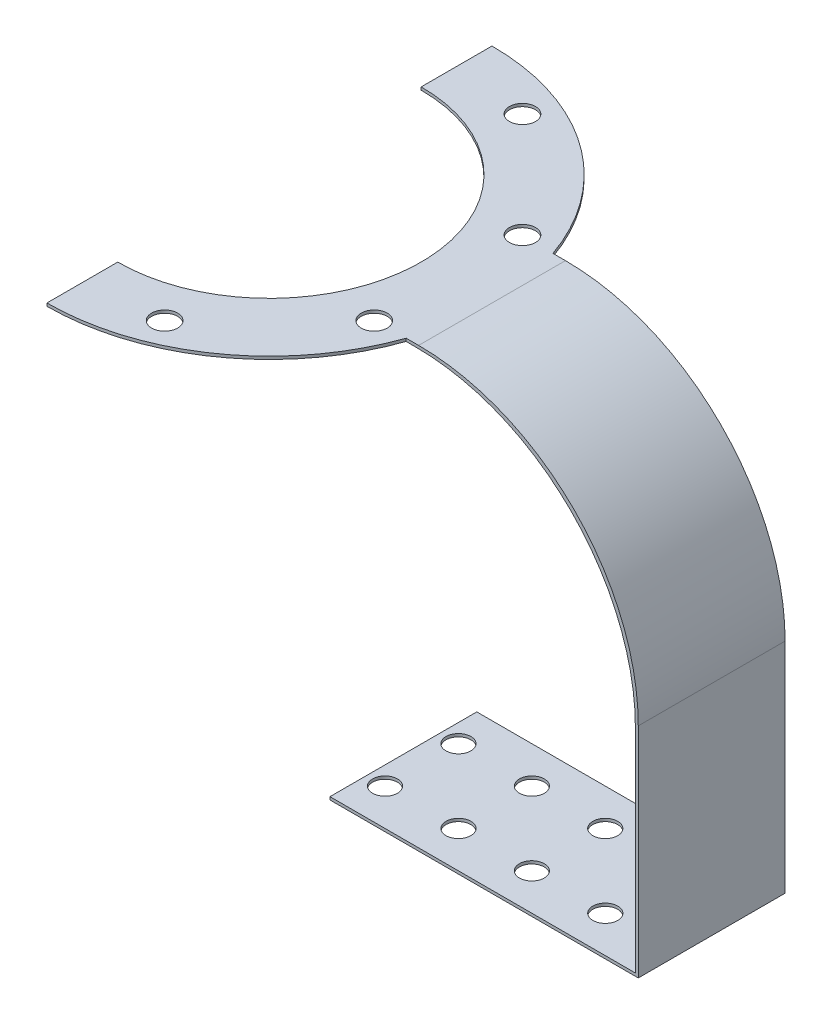
ISO-10303-21;
HEADER;
FILE_DESCRIPTION(('STEP AP214'),'2;1');
FILE_NAME('part.step','',(''),(''),'','','');
FILE_SCHEMA(('AUTOMOTIVE_DESIGN { 1 0 10303 214 1 1 1 1 }'));
ENDSEC;
DATA;
#1=APPLICATION_CONTEXT('core data for automotive mechanical design processes');
#2=APPLICATION_PROTOCOL_DEFINITION('international standard','automotive_design',2000,#1);
#3=PRODUCT_CONTEXT('',#1,'mechanical');
#4=PRODUCT('Part','Part','',(#3));
#5=PRODUCT_RELATED_PRODUCT_CATEGORY('part','',(#4));
#6=PRODUCT_DEFINITION_FORMATION('','',#4);
#7=PRODUCT_DEFINITION_CONTEXT('part definition',#1,'design');
#8=PRODUCT_DEFINITION('design','',#6,#7);
#9=PRODUCT_DEFINITION_SHAPE('','',#8);
#10=(LENGTH_UNIT() NAMED_UNIT(*) SI_UNIT(.MILLI.,.METRE.));
#11=(NAMED_UNIT(*) PLANE_ANGLE_UNIT() SI_UNIT($,.RADIAN.));
#12=(NAMED_UNIT(*) SI_UNIT($,.STERADIAN.) SOLID_ANGLE_UNIT());
#13=UNCERTAINTY_MEASURE_WITH_UNIT(LENGTH_MEASURE(1.E-05),#10,'distance_accuracy_value','');
#14=(GEOMETRIC_REPRESENTATION_CONTEXT(3) GLOBAL_UNCERTAINTY_ASSIGNED_CONTEXT((#13)) GLOBAL_UNIT_ASSIGNED_CONTEXT((#10,
#11,#12)) REPRESENTATION_CONTEXT('',''));
#15=CARTESIAN_POINT('',(0.,0.,0.));
#16=DIRECTION('',(0.,0.,1.));
#17=DIRECTION('',(1.,0.,0.));
#18=AXIS2_PLACEMENT_3D('',#15,#16,#17);
#19=CARTESIAN_POINT('',(0.,0.,25.4));
#20=DIRECTION('',(0.,-1.,0.));
#21=DIRECTION('',(0.,0.,-1.));
#22=AXIS2_PLACEMENT_3D('',#19,#20,#21);
#23=PLANE('',#22);
#24=CARTESIAN_POINT('',(-37.46,0.,6.35));
#25=DIRECTION('',(0.,-1.,0.));
#26=DIRECTION('',(0.,0.,-1.));
#27=AXIS2_PLACEMENT_3D('',#24,#25,#26);
#28=CIRCLE('',#27,2.15265);
#29=CARTESIAN_POINT('',(-37.46,0.,4.19735));
#30=VERTEX_POINT('',#29);
#31=EDGE_CURVE('E254',#30,#30,#28,.T.);
#32=ORIENTED_EDGE('',*,*,#31,.F.);
#33=EDGE_LOOP('',(#32));
#34=FACE_BOUND('',#33,.T.);
#35=CARTESIAN_POINT('',(-12.06,0.,19.05));
#36=DIRECTION('',(0.,-1.,0.));
#37=DIRECTION('',(0.,0.,-1.));
#38=AXIS2_PLACEMENT_3D('',#35,#36,#37);
#39=CIRCLE('',#38,2.15265);
#40=CARTESIAN_POINT('',(-12.06,0.,16.89735));
#41=VERTEX_POINT('',#40);
#42=EDGE_CURVE('E253',#41,#41,#39,.T.);
#43=ORIENTED_EDGE('',*,*,#42,.F.);
#44=EDGE_LOOP('',(#43));
#45=FACE_BOUND('',#44,.T.);
#46=CARTESIAN_POINT('',(-24.76,0.,19.05));
#47=DIRECTION('',(0.,-1.,0.));
#48=DIRECTION('',(0.,0.,-1.));
#49=AXIS2_PLACEMENT_3D('',#46,#47,#48);
#50=CIRCLE('',#49,2.15265);
#51=CARTESIAN_POINT('',(-24.76,0.,16.89735));
#52=VERTEX_POINT('',#51);
#53=EDGE_CURVE('E270',#52,#52,#50,.T.);
#54=ORIENTED_EDGE('',*,*,#53,.F.);
#55=EDGE_LOOP('',(#54));
#56=FACE_BOUND('',#55,.T.);
#57=CARTESIAN_POINT('',(-37.46,0.,19.05));
#58=DIRECTION('',(0.,-1.,0.));
#59=DIRECTION('',(0.,0.,-1.));
#60=AXIS2_PLACEMENT_3D('',#57,#58,#59);
#61=CIRCLE('',#60,2.15265);
#62=CARTESIAN_POINT('',(-37.46,0.,16.89735));
#63=VERTEX_POINT('',#62);
#64=EDGE_CURVE('E269',#63,#63,#61,.T.);
#65=ORIENTED_EDGE('',*,*,#64,.F.);
#66=EDGE_LOOP('',(#65));
#67=FACE_BOUND('',#66,.T.);
#68=CARTESIAN_POINT('',(-24.76,0.,6.35));
#69=DIRECTION('',(0.,-1.,0.));
#70=DIRECTION('',(0.,0.,-1.));
#71=AXIS2_PLACEMENT_3D('',#68,#69,#70);
#72=CIRCLE('',#71,2.15265);
#73=CARTESIAN_POINT('',(-24.76,0.,4.19735));
#74=VERTEX_POINT('',#73);
#75=EDGE_CURVE('E229',#74,#74,#72,.T.);
#76=ORIENTED_EDGE('',*,*,#75,.F.);
#77=EDGE_LOOP('',(#76));
#78=FACE_BOUND('',#77,.T.);
#79=CARTESIAN_POINT('',(-12.06,0.,6.35));
#80=DIRECTION('',(0.,-1.,0.));
#81=DIRECTION('',(0.,0.,-1.));
#82=AXIS2_PLACEMENT_3D('',#79,#80,#81);
#83=CIRCLE('',#82,2.15265);
#84=CARTESIAN_POINT('',(-12.06,0.,4.19735));
#85=VERTEX_POINT('',#84);
#86=EDGE_CURVE('E230',#85,#85,#83,.T.);
#87=ORIENTED_EDGE('',*,*,#86,.F.);
#88=EDGE_LOOP('',(#87));
#89=FACE_BOUND('',#88,.T.);
#90=CARTESIAN_POINT('',(-50.16,0.,6.35));
#91=DIRECTION('',(0.,-1.,0.));
#92=DIRECTION('',(0.,0.,-1.));
#93=AXIS2_PLACEMENT_3D('',#90,#91,#92);
#94=CIRCLE('',#93,2.15265);
#95=CARTESIAN_POINT('',(-50.16,0.,4.19735));
#96=VERTEX_POINT('',#95);
#97=EDGE_CURVE('E239',#96,#96,#94,.T.);
#98=ORIENTED_EDGE('',*,*,#97,.F.);
#99=EDGE_LOOP('',(#98));
#100=FACE_BOUND('',#99,.T.);
#101=CARTESIAN_POINT('',(-50.16,0.,19.05));
#102=DIRECTION('',(0.,-1.,0.));
#103=DIRECTION('',(0.,0.,-1.));
#104=AXIS2_PLACEMENT_3D('',#101,#102,#103);
#105=CIRCLE('',#104,2.15265);
#106=CARTESIAN_POINT('',(-50.16,0.,16.89735));
#107=VERTEX_POINT('',#106);
#108=EDGE_CURVE('E274',#107,#107,#105,.T.);
#109=ORIENTED_EDGE('',*,*,#108,.F.);
#110=EDGE_LOOP('',(#109));
#111=FACE_BOUND('',#110,.T.);
#112=DIRECTION('',(-1.,0.,0.));
#113=VECTOR('',#112,1.);
#114=CARTESIAN_POINT('',(0.,0.,0.));
#115=LINE('',#114,#113);
#116=CARTESIAN_POINT('',(0.,0.,0.));
#117=VERTEX_POINT('',#116);
#118=CARTESIAN_POINT('',(-53.34,0.,0.));
#119=VERTEX_POINT('',#118);
#120=EDGE_CURVE('E288',#117,#119,#115,.T.);
#121=ORIENTED_EDGE('',*,*,#120,.F.);
#122=DIRECTION('',(0.,0.,-1.));
#123=VECTOR('',#122,1.);
#124=CARTESIAN_POINT('',(0.,0.,25.4));
#125=LINE('',#124,#123);
#126=CARTESIAN_POINT('',(0.,0.,25.4));
#127=VERTEX_POINT('',#126);
#128=EDGE_CURVE('E348',#127,#117,#125,.T.);
#129=ORIENTED_EDGE('',*,*,#128,.F.);
#130=DIRECTION('',(-1.,0.,0.));
#131=VECTOR('',#130,1.);
#132=CARTESIAN_POINT('',(0.,0.,25.4));
#133=LINE('',#132,#131);
#134=CARTESIAN_POINT('',(-53.34,0.,25.4));
#135=VERTEX_POINT('',#134);
#136=EDGE_CURVE('E289',#127,#135,#133,.T.);
#137=ORIENTED_EDGE('',*,*,#136,.T.);
#138=DIRECTION('',(0.,0.,-1.));
#139=VECTOR('',#138,1.);
#140=CARTESIAN_POINT('',(-53.34,0.,25.4));
#141=LINE('',#140,#139);
#142=EDGE_CURVE('E315',#135,#119,#141,.T.);
#143=ORIENTED_EDGE('',*,*,#142,.T.);
#144=EDGE_LOOP('',(#121,#129,#137,#143));
#145=FACE_BOUND('',#144,.T.);
#146=ADVANCED_FACE('F45',(#34,#45,#56,#67,#78,#89,#100,#111,#145),#23,.T.);
#147=CARTESIAN_POINT('',(0.,0.,25.4));
#148=DIRECTION('',(-1.,0.,0.));
#149=DIRECTION('',(0.,0.,1.));
#150=AXIS2_PLACEMENT_3D('',#147,#148,#149);
#151=PLANE('',#150);
#152=DIRECTION('',(0.,1.,0.));
#153=VECTOR('',#152,1.);
#154=CARTESIAN_POINT('',(0.,0.,0.));
#155=LINE('',#154,#153);
#156=CARTESIAN_POINT('',(0.,37.78,0.));
#157=VERTEX_POINT('',#156);
#158=EDGE_CURVE('E319',#117,#157,#155,.T.);
#159=ORIENTED_EDGE('',*,*,#158,.T.);
#160=DIRECTION('',(0.,0.,-1.));
#161=VECTOR('',#160,1.);
#162=CARTESIAN_POINT('',(0.,37.78,25.4));
#163=LINE('',#162,#161);
#164=CARTESIAN_POINT('',(0.,37.78,25.4));
#165=VERTEX_POINT('',#164);
#166=EDGE_CURVE('E61',#157,#165,#163,.F.);
#167=ORIENTED_EDGE('',*,*,#166,.T.);
#168=DIRECTION('',(0.,1.,0.));
#169=VECTOR('',#168,1.);
#170=CARTESIAN_POINT('',(0.,0.,25.4));
#171=LINE('',#170,#169);
#172=EDGE_CURVE('E293',#127,#165,#171,.T.);
#173=ORIENTED_EDGE('',*,*,#172,.F.);
#174=ORIENTED_EDGE('',*,*,#128,.T.);
#175=EDGE_LOOP('',(#159,#167,#173,#174));
#176=FACE_BOUND('',#175,.T.);
#177=ADVANCED_FACE('F432',(#176),#151,.F.);
#178=CARTESIAN_POINT('',(0.,75.78,25.4));
#179=DIRECTION('',(0.,1.,0.));
#180=DIRECTION('',(0.,0.,1.));
#181=AXIS2_PLACEMENT_3D('',#178,#179,#180);
#182=PLANE('',#181);
#183=DIRECTION('',(1.,0.,0.));
#184=VECTOR('',#183,1.);
#185=CARTESIAN_POINT('',(0.,75.78,25.4));
#186=LINE('',#185,#184);
#187=CARTESIAN_POINT('',(-40.1647747168782,75.78,25.4));
#188=VERTEX_POINT('',#187);
#189=CARTESIAN_POINT('',(-38.,75.78,25.4));
#190=VERTEX_POINT('',#189);
#191=EDGE_CURVE('E297',#188,#190,#186,.T.);
#192=ORIENTED_EDGE('',*,*,#191,.T.);
#193=DIRECTION('',(0.,0.,-1.));
#194=VECTOR('',#193,1.);
#195=CARTESIAN_POINT('',(-38.,75.78,0.));
#196=LINE('',#195,#194);
#197=CARTESIAN_POINT('',(-38.,75.78,0.));
#198=VERTEX_POINT('',#197);
#199=EDGE_CURVE('E362',#190,#198,#196,.T.);
#200=ORIENTED_EDGE('',*,*,#199,.T.);
#201=DIRECTION('',(1.,0.,0.));
#202=VECTOR('',#201,1.);
#203=CARTESIAN_POINT('',(0.,75.78,0.));
#204=LINE('',#203,#202);
#205=CARTESIAN_POINT('',(-40.1647747168782,75.78,0.));
#206=VERTEX_POINT('',#205);
#207=EDGE_CURVE('E322',#206,#198,#204,.T.);
#208=ORIENTED_EDGE('',*,*,#207,.F.);
#209=CARTESIAN_POINT('',(-76.50978813,75.78,12.7));
#210=DIRECTION('',(0.,1.,0.));
#211=DIRECTION('',(0.,0.,1.));
#212=AXIS2_PLACEMENT_3D('',#209,#210,#211);
#213=CIRCLE('',#212,38.5);
#214=CARTESIAN_POINT('',(-76.50978813,75.78,-25.8));
#215=VERTEX_POINT('',#214);
#216=EDGE_CURVE('E172',#206,#215,#213,.T.);
#217=ORIENTED_EDGE('',*,*,#216,.T.);
#218=DIRECTION('',(0.,0.,1.));
#219=VECTOR('',#218,1.);
#220=CARTESIAN_POINT('',(-76.50978813,75.78,0.));
#221=LINE('',#220,#219);
#222=CARTESIAN_POINT('',(-76.50978813,75.78,-13.55));
#223=VERTEX_POINT('',#222);
#224=EDGE_CURVE('E171',#215,#223,#221,.T.);
#225=ORIENTED_EDGE('',*,*,#224,.T.);
#226=CARTESIAN_POINT('',(-76.50978813,75.78,12.7));
#227=DIRECTION('',(0.,1.,0.));
#228=DIRECTION('',(0.,0.,1.));
#229=AXIS2_PLACEMENT_3D('',#226,#227,#228);
#230=CIRCLE('',#229,26.25);
#231=CARTESIAN_POINT('',(-76.50978813,75.78,38.95));
#232=VERTEX_POINT('',#231);
#233=EDGE_CURVE('E177',#232,#223,#230,.T.);
#234=ORIENTED_EDGE('',*,*,#233,.F.);
#235=DIRECTION('',(0.,0.,1.));
#236=VECTOR('',#235,1.);
#237=CARTESIAN_POINT('',(-76.50978813,75.78,0.));
#238=LINE('',#237,#236);
#239=CARTESIAN_POINT('',(-76.50978813,75.78,51.2));
#240=VERTEX_POINT('',#239);
#241=EDGE_CURVE('E153',#232,#240,#238,.T.);
#242=ORIENTED_EDGE('',*,*,#241,.T.);
#243=EDGE_CURVE('E164',#240,#188,#213,.T.);
#244=ORIENTED_EDGE('',*,*,#243,.T.);
#245=EDGE_LOOP('',(#192,#200,#208,#217,#225,#234,#242,#244));
#246=FACE_BOUND('',#245,.T.);
#247=CARTESIAN_POINT('',(-45.559823790872,75.78,-0.119894984230734));
#248=DIRECTION('',(0.,1.,0.));
#249=DIRECTION('',(0.,0.,1.));
#250=AXIS2_PLACEMENT_3D('',#247,#248,#249);
#251=CIRCLE('',#250,2.25);
#252=CARTESIAN_POINT('',(-45.559823790872,75.78,2.13010501576927));
#253=VERTEX_POINT('',#252);
#254=EDGE_CURVE('E190',#253,#253,#251,.T.);
#255=ORIENTED_EDGE('',*,*,#254,.F.);
#256=EDGE_LOOP('',(#255));
#257=FACE_BOUND('',#256,.T.);
#258=CARTESIAN_POINT('',(-45.5598237908718,75.78,25.5198949842303));
#259=DIRECTION('',(0.,1.,0.));
#260=DIRECTION('',(0.,0.,1.));
#261=AXIS2_PLACEMENT_3D('',#258,#259,#260);
#262=CIRCLE('',#261,2.25);
#263=CARTESIAN_POINT('',(-45.5598237908718,75.78,27.7698949842303));
#264=VERTEX_POINT('',#263);
#265=EDGE_CURVE('E198',#264,#264,#262,.T.);
#266=ORIENTED_EDGE('',*,*,#265,.F.);
#267=EDGE_LOOP('',(#266));
#268=FACE_BOUND('',#267,.T.);
#269=CARTESIAN_POINT('',(-63.6898931457697,75.78,-18.2499643391282));
#270=DIRECTION('',(0.,1.,0.));
#271=DIRECTION('',(0.,0.,1.));
#272=AXIS2_PLACEMENT_3D('',#269,#270,#271);
#273=CIRCLE('',#272,2.25);
#274=CARTESIAN_POINT('',(-63.6898931457697,75.78,-15.9999643391282));
#275=VERTEX_POINT('',#274);
#276=EDGE_CURVE('E194',#275,#275,#273,.T.);
#277=ORIENTED_EDGE('',*,*,#276,.F.);
#278=EDGE_LOOP('',(#277));
#279=FACE_BOUND('',#278,.T.);
#280=CARTESIAN_POINT('',(-63.6898931457693,75.78,43.649964339128));
#281=DIRECTION('',(0.,1.,0.));
#282=DIRECTION('',(0.,0.,1.));
#283=AXIS2_PLACEMENT_3D('',#280,#281,#282);
#284=CIRCLE('',#283,2.25);
#285=CARTESIAN_POINT('',(-63.6898931457693,75.78,45.899964339128));
#286=VERTEX_POINT('',#285);
#287=EDGE_CURVE('E160',#286,#286,#284,.T.);
#288=ORIENTED_EDGE('',*,*,#287,.F.);
#289=EDGE_LOOP('',(#288));
#290=FACE_BOUND('',#289,.T.);
#291=ADVANCED_FACE('F174',(#246,#257,#268,#279,#290),#182,.T.);
#292=CARTESIAN_POINT('',(0.,75.28,25.4));
#293=DIRECTION('',(0.,1.,0.));
#294=DIRECTION('',(0.,0.,1.));
#295=AXIS2_PLACEMENT_3D('',#292,#293,#294);
#296=PLANE('',#295);
#297=DIRECTION('',(1.,0.,0.));
#298=VECTOR('',#297,1.);
#299=CARTESIAN_POINT('',(0.,75.28,0.));
#300=LINE('',#299,#298);
#301=CARTESIAN_POINT('',(-40.1647747168782,75.28,0.));
#302=VERTEX_POINT('',#301);
#303=CARTESIAN_POINT('',(-38.5,75.28,0.));
#304=VERTEX_POINT('',#303);
#305=EDGE_CURVE('E325',#302,#304,#300,.T.);
#306=ORIENTED_EDGE('',*,*,#305,.T.);
#307=DIRECTION('',(0.,0.,-1.));
#308=VECTOR('',#307,1.);
#309=CARTESIAN_POINT('',(-38.5,75.28,25.4));
#310=LINE('',#309,#308);
#311=CARTESIAN_POINT('',(-38.5,75.28,25.4));
#312=VERTEX_POINT('',#311);
#313=EDGE_CURVE('E359',#304,#312,#310,.F.);
#314=ORIENTED_EDGE('',*,*,#313,.T.);
#315=DIRECTION('',(1.,0.,0.));
#316=VECTOR('',#315,1.);
#317=CARTESIAN_POINT('',(0.,75.28,25.4));
#318=LINE('',#317,#316);
#319=CARTESIAN_POINT('',(-40.1647747168782,75.28,25.4));
#320=VERTEX_POINT('',#319);
#321=EDGE_CURVE('E300',#320,#312,#318,.T.);
#322=ORIENTED_EDGE('',*,*,#321,.F.);
#323=CARTESIAN_POINT('',(-76.50978813,75.28,12.7));
#324=DIRECTION('',(0.,1.,0.));
#325=DIRECTION('',(0.,0.,1.));
#326=AXIS2_PLACEMENT_3D('',#323,#324,#325);
#327=CIRCLE('',#326,38.5);
#328=CARTESIAN_POINT('',(-76.50978813,75.28,51.2));
#329=VERTEX_POINT('',#328);
#330=EDGE_CURVE('E384',#320,#329,#327,.F.);
#331=ORIENTED_EDGE('',*,*,#330,.T.);
#332=DIRECTION('',(0.,0.,-1.));
#333=VECTOR('',#332,1.);
#334=CARTESIAN_POINT('',(-76.50978813,75.28,0.));
#335=LINE('',#334,#333);
#336=CARTESIAN_POINT('',(-76.50978813,75.28,38.95));
#337=VERTEX_POINT('',#336);
#338=EDGE_CURVE('E155',#329,#337,#335,.T.);
#339=ORIENTED_EDGE('',*,*,#338,.T.);
#340=CARTESIAN_POINT('',(-76.50978813,75.28,12.7));
#341=DIRECTION('',(0.,1.,0.));
#342=DIRECTION('',(0.,0.,1.));
#343=AXIS2_PLACEMENT_3D('',#340,#341,#342);
#344=CIRCLE('',#343,26.25);
#345=CARTESIAN_POINT('',(-76.50978813,75.28,-13.55));
#346=VERTEX_POINT('',#345);
#347=EDGE_CURVE('E388',#346,#337,#344,.F.);
#348=ORIENTED_EDGE('',*,*,#347,.F.);
#349=DIRECTION('',(0.,0.,-1.));
#350=VECTOR('',#349,1.);
#351=CARTESIAN_POINT('',(-76.50978813,75.28,0.));
#352=LINE('',#351,#350);
#353=CARTESIAN_POINT('',(-76.50978813,75.28,-25.8));
#354=VERTEX_POINT('',#353);
#355=EDGE_CURVE('E208',#346,#354,#352,.T.);
#356=ORIENTED_EDGE('',*,*,#355,.T.);
#357=EDGE_CURVE('E382',#354,#302,#327,.F.);
#358=ORIENTED_EDGE('',*,*,#357,.T.);
#359=EDGE_LOOP('',(#306,#314,#322,#331,#339,#348,#356,#358));
#360=FACE_BOUND('',#359,.T.);
#361=CARTESIAN_POINT('',(-45.5598237908718,75.28,25.5198949842303));
#362=DIRECTION('',(0.,1.,0.));
#363=DIRECTION('',(0.,0.,1.));
#364=AXIS2_PLACEMENT_3D('',#361,#362,#363);
#365=CIRCLE('',#364,2.25);
#366=CARTESIAN_POINT('',(-45.5598237908718,75.28,27.7698949842303));
#367=VERTEX_POINT('',#366);
#368=EDGE_CURVE('E183',#367,#367,#365,.F.);
#369=ORIENTED_EDGE('',*,*,#368,.F.);
#370=EDGE_LOOP('',(#369));
#371=FACE_BOUND('',#370,.T.);
#372=CARTESIAN_POINT('',(-45.559823790872,75.28,-0.119894984230734));
#373=DIRECTION('',(0.,1.,0.));
#374=DIRECTION('',(0.,0.,1.));
#375=AXIS2_PLACEMENT_3D('',#372,#373,#374);
#376=CIRCLE('',#375,2.25);
#377=CARTESIAN_POINT('',(-45.559823790872,75.28,2.13010501576927));
#378=VERTEX_POINT('',#377);
#379=EDGE_CURVE('E220',#378,#378,#376,.F.);
#380=ORIENTED_EDGE('',*,*,#379,.F.);
#381=EDGE_LOOP('',(#380));
#382=FACE_BOUND('',#381,.T.);
#383=CARTESIAN_POINT('',(-63.6898931457697,75.28,-18.2499643391282));
#384=DIRECTION('',(0.,1.,0.));
#385=DIRECTION('',(0.,0.,1.));
#386=AXIS2_PLACEMENT_3D('',#383,#384,#385);
#387=CIRCLE('',#386,2.25);
#388=CARTESIAN_POINT('',(-63.6898931457697,75.28,-15.9999643391282));
#389=VERTEX_POINT('',#388);
#390=EDGE_CURVE('E221',#389,#389,#387,.F.);
#391=ORIENTED_EDGE('',*,*,#390,.F.);
#392=EDGE_LOOP('',(#391));
#393=FACE_BOUND('',#392,.T.);
#394=CARTESIAN_POINT('',(-63.6898931457693,75.28,43.649964339128));
#395=DIRECTION('',(0.,1.,0.));
#396=DIRECTION('',(0.,0.,1.));
#397=AXIS2_PLACEMENT_3D('',#394,#395,#396);
#398=CIRCLE('',#397,2.25);
#399=CARTESIAN_POINT('',(-63.6898931457693,75.28,45.899964339128));
#400=VERTEX_POINT('',#399);
#401=EDGE_CURVE('E216',#400,#400,#398,.F.);
#402=ORIENTED_EDGE('',*,*,#401,.F.);
#403=EDGE_LOOP('',(#402));
#404=FACE_BOUND('',#403,.T.);
#405=ADVANCED_FACE('F396',(#360,#371,#382,#393,#404),#296,.F.);
#406=CARTESIAN_POINT('',(-0.5,0.,25.4));
#407=DIRECTION('',(-1.,0.,0.));
#408=DIRECTION('',(0.,-1.,0.));
#409=AXIS2_PLACEMENT_3D('',#406,#407,#408);
#410=PLANE('',#409);
#411=DIRECTION('',(0.,1.,0.));
#412=VECTOR('',#411,1.);
#413=CARTESIAN_POINT('',(-0.5,0.,25.4));
#414=LINE('',#413,#412);
#415=CARTESIAN_POINT('',(-0.5,0.499999999999993,25.4));
#416=VERTEX_POINT('',#415);
#417=CARTESIAN_POINT('',(-0.5,37.28,25.4));
#418=VERTEX_POINT('',#417);
#419=EDGE_CURVE('E304',#416,#418,#414,.T.);
#420=ORIENTED_EDGE('',*,*,#419,.T.);
#421=DIRECTION('',(0.,0.,-1.));
#422=VECTOR('',#421,1.);
#423=CARTESIAN_POINT('',(-0.5,37.28,25.4));
#424=LINE('',#423,#422);
#425=CARTESIAN_POINT('',(-0.5,37.28,0.));
#426=VERTEX_POINT('',#425);
#427=EDGE_CURVE('E355',#418,#426,#424,.T.);
#428=ORIENTED_EDGE('',*,*,#427,.T.);
#429=DIRECTION('',(0.,1.,0.));
#430=VECTOR('',#429,1.);
#431=CARTESIAN_POINT('',(-0.5,0.,0.));
#432=LINE('',#431,#430);
#433=CARTESIAN_POINT('',(-0.5,0.499999999999993,0.));
#434=VERTEX_POINT('',#433);
#435=EDGE_CURVE('E329',#434,#426,#432,.T.);
#436=ORIENTED_EDGE('',*,*,#435,.F.);
#437=DIRECTION('',(0.,0.,-1.));
#438=VECTOR('',#437,1.);
#439=CARTESIAN_POINT('',(-0.5,0.499999999999993,25.4));
#440=LINE('',#439,#438);
#441=EDGE_CURVE('E345',#416,#434,#440,.T.);
#442=ORIENTED_EDGE('',*,*,#441,.F.);
#443=EDGE_LOOP('',(#420,#428,#436,#442));
#444=FACE_BOUND('',#443,.T.);
#445=ADVANCED_FACE('F419',(#444),#410,.T.);
#446=CARTESIAN_POINT('',(0.,0.499999999999993,25.4));
#447=DIRECTION('',(0.,1.,0.));
#448=DIRECTION('',(-1.,0.,0.));
#449=AXIS2_PLACEMENT_3D('',#446,#447,#448);
#450=PLANE('',#449);
#451=CARTESIAN_POINT('',(-37.46,0.499999999999994,6.35));
#452=DIRECTION('',(0.,1.,0.));
#453=DIRECTION('',(-1.,0.,0.));
#454=AXIS2_PLACEMENT_3D('',#451,#452,#453);
#455=CIRCLE('',#454,2.15265);
#456=CARTESIAN_POINT('',(-39.61265,0.499999999999994,6.35));
#457=VERTEX_POINT('',#456);
#458=EDGE_CURVE('E234',#457,#457,#455,.F.);
#459=ORIENTED_EDGE('',*,*,#458,.T.);
#460=EDGE_LOOP('',(#459));
#461=FACE_BOUND('',#460,.T.);
#462=CARTESIAN_POINT('',(-12.06,0.499999999999994,19.05));
#463=DIRECTION('',(0.,1.,0.));
#464=DIRECTION('',(-1.,0.,0.));
#465=AXIS2_PLACEMENT_3D('',#462,#463,#464);
#466=CIRCLE('',#465,2.15265);
#467=CARTESIAN_POINT('',(-14.21265,0.499999999999994,19.05));
#468=VERTEX_POINT('',#467);
#469=EDGE_CURVE('E249',#468,#468,#466,.F.);
#470=ORIENTED_EDGE('',*,*,#469,.T.);
#471=EDGE_LOOP('',(#470));
#472=FACE_BOUND('',#471,.T.);
#473=CARTESIAN_POINT('',(-24.76,0.499999999999994,19.05));
#474=DIRECTION('',(0.,1.,0.));
#475=DIRECTION('',(-1.,0.,0.));
#476=AXIS2_PLACEMENT_3D('',#473,#474,#475);
#477=CIRCLE('',#476,2.15265);
#478=CARTESIAN_POINT('',(-26.91265,0.499999999999994,19.05));
#479=VERTEX_POINT('',#478);
#480=EDGE_CURVE('E258',#479,#479,#477,.F.);
#481=ORIENTED_EDGE('',*,*,#480,.T.);
#482=EDGE_LOOP('',(#481));
#483=FACE_BOUND('',#482,.T.);
#484=CARTESIAN_POINT('',(-37.46,0.499999999999994,19.05));
#485=DIRECTION('',(0.,1.,0.));
#486=DIRECTION('',(-1.,0.,0.));
#487=AXIS2_PLACEMENT_3D('',#484,#485,#486);
#488=CIRCLE('',#487,2.15265);
#489=CARTESIAN_POINT('',(-39.61265,0.499999999999994,19.05));
#490=VERTEX_POINT('',#489);
#491=EDGE_CURVE('E265',#490,#490,#488,.F.);
#492=ORIENTED_EDGE('',*,*,#491,.T.);
#493=EDGE_LOOP('',(#492));
#494=FACE_BOUND('',#493,.T.);
#495=CARTESIAN_POINT('',(-24.76,0.499999999999994,6.35));
#496=DIRECTION('',(0.,1.,0.));
#497=DIRECTION('',(-1.,0.,0.));
#498=AXIS2_PLACEMENT_3D('',#495,#496,#497);
#499=CIRCLE('',#498,2.15265);
#500=CARTESIAN_POINT('',(-26.91265,0.499999999999994,6.35));
#501=VERTEX_POINT('',#500);
#502=EDGE_CURVE('E225',#501,#501,#499,.F.);
#503=ORIENTED_EDGE('',*,*,#502,.T.);
#504=EDGE_LOOP('',(#503));
#505=FACE_BOUND('',#504,.T.);
#506=CARTESIAN_POINT('',(-12.06,0.499999999999994,6.35));
#507=DIRECTION('',(0.,1.,0.));
#508=DIRECTION('',(-1.,0.,0.));
#509=AXIS2_PLACEMENT_3D('',#506,#507,#508);
#510=CIRCLE('',#509,2.15265);
#511=CARTESIAN_POINT('',(-14.21265,0.499999999999994,6.35));
#512=VERTEX_POINT('',#511);
#513=EDGE_CURVE('E235',#512,#512,#510,.F.);
#514=ORIENTED_EDGE('',*,*,#513,.T.);
#515=EDGE_LOOP('',(#514));
#516=FACE_BOUND('',#515,.T.);
#517=CARTESIAN_POINT('',(-50.16,0.499999999999994,6.35));
#518=DIRECTION('',(0.,1.,0.));
#519=DIRECTION('',(-1.,0.,0.));
#520=AXIS2_PLACEMENT_3D('',#517,#518,#519);
#521=CIRCLE('',#520,2.15265);
#522=CARTESIAN_POINT('',(-52.31265,0.499999999999994,6.35));
#523=VERTEX_POINT('',#522);
#524=EDGE_CURVE('E224',#523,#523,#521,.F.);
#525=ORIENTED_EDGE('',*,*,#524,.T.);
#526=EDGE_LOOP('',(#525));
#527=FACE_BOUND('',#526,.T.);
#528=CARTESIAN_POINT('',(-50.16,0.499999999999994,19.05));
#529=DIRECTION('',(0.,1.,0.));
#530=DIRECTION('',(-1.,0.,0.));
#531=AXIS2_PLACEMENT_3D('',#528,#529,#530);
#532=CIRCLE('',#531,2.15265);
#533=CARTESIAN_POINT('',(-52.31265,0.499999999999994,19.05));
#534=VERTEX_POINT('',#533);
#535=EDGE_CURVE('E284',#534,#534,#532,.F.);
#536=ORIENTED_EDGE('',*,*,#535,.T.);
#537=EDGE_LOOP('',(#536));
#538=FACE_BOUND('',#537,.T.);
#539=DIRECTION('',(1.,0.,0.));
#540=VECTOR('',#539,1.);
#541=CARTESIAN_POINT('',(0.,0.499999999999993,0.));
#542=LINE('',#541,#540);
#543=CARTESIAN_POINT('',(-53.34,0.499999999999994,0.));
#544=VERTEX_POINT('',#543);
#545=EDGE_CURVE('E333',#544,#434,#542,.T.);
#546=ORIENTED_EDGE('',*,*,#545,.F.);
#547=DIRECTION('',(0.,0.,-1.));
#548=VECTOR('',#547,1.);
#549=CARTESIAN_POINT('',(-53.34,0.499999999999994,25.4));
#550=LINE('',#549,#548);
#551=CARTESIAN_POINT('',(-53.34,0.499999999999994,25.4));
#552=VERTEX_POINT('',#551);
#553=EDGE_CURVE('E342',#552,#544,#550,.T.);
#554=ORIENTED_EDGE('',*,*,#553,.F.);
#555=DIRECTION('',(1.,0.,0.));
#556=VECTOR('',#555,1.);
#557=CARTESIAN_POINT('',(0.,0.499999999999993,25.4));
#558=LINE('',#557,#556);
#559=EDGE_CURVE('E308',#552,#416,#558,.T.);
#560=ORIENTED_EDGE('',*,*,#559,.T.);
#561=ORIENTED_EDGE('',*,*,#441,.T.);
#562=EDGE_LOOP('',(#546,#554,#560,#561));
#563=FACE_BOUND('',#562,.T.);
#564=ADVANCED_FACE('F423',(#461,#472,#483,#494,#505,#516,#527,#538,#563),#450,.T.);
#565=CARTESIAN_POINT('',(-53.34,0.,25.4));
#566=DIRECTION('',(1.,0.,0.));
#567=DIRECTION('',(0.,0.,-1.));
#568=AXIS2_PLACEMENT_3D('',#565,#566,#567);
#569=PLANE('',#568);
#570=DIRECTION('',(0.,-1.,0.));
#571=VECTOR('',#570,1.);
#572=CARTESIAN_POINT('',(-53.34,0.,0.));
#573=LINE('',#572,#571);
#574=EDGE_CURVE('E294',#544,#119,#573,.T.);
#575=ORIENTED_EDGE('',*,*,#574,.T.);
#576=ORIENTED_EDGE('',*,*,#142,.F.);
#577=DIRECTION('',(0.,-1.,0.));
#578=VECTOR('',#577,1.);
#579=CARTESIAN_POINT('',(-53.34,0.,25.4));
#580=LINE('',#579,#578);
#581=EDGE_CURVE('E312',#552,#135,#580,.T.);
#582=ORIENTED_EDGE('',*,*,#581,.F.);
#583=ORIENTED_EDGE('',*,*,#553,.T.);
#584=EDGE_LOOP('',(#575,#576,#582,#583));
#585=FACE_BOUND('',#584,.T.);
#586=ADVANCED_FACE('F428',(#585),#569,.F.);
#587=CARTESIAN_POINT('',(0.,0.,25.4));
#588=DIRECTION('',(0.,0.,1.));
#589=DIRECTION('',(1.,0.,0.));
#590=AXIS2_PLACEMENT_3D('',#587,#588,#589);
#591=PLANE('',#590);
#592=ORIENTED_EDGE('',*,*,#172,.T.);
#593=CARTESIAN_POINT('',(-38.,37.78,25.4));
#594=DIRECTION('',(0.,0.,1.));
#595=DIRECTION('',(1.,0.,0.));
#596=AXIS2_PLACEMENT_3D('',#593,#594,#595);
#597=CIRCLE('',#596,38.);
#598=EDGE_CURVE('E11',#165,#190,#597,.T.);
#599=ORIENTED_EDGE('',*,*,#598,.T.);
#600=ORIENTED_EDGE('',*,*,#191,.F.);
#601=DIRECTION('',(0.,1.,0.));
#602=VECTOR('',#601,1.);
#603=CARTESIAN_POINT('',(-40.1647747168782,-10.8086171337419,25.4));
#604=LINE('',#603,#602);
#605=EDGE_CURVE('E167',#320,#188,#604,.T.);
#606=ORIENTED_EDGE('',*,*,#605,.F.);
#607=ORIENTED_EDGE('',*,*,#321,.T.);
#608=CARTESIAN_POINT('',(-38.5,37.28,25.4));
#609=DIRECTION('',(0.,0.,1.));
#610=DIRECTION('',(1.,0.,0.));
#611=AXIS2_PLACEMENT_3D('',#608,#609,#610);
#612=CIRCLE('',#611,38.);
#613=EDGE_CURVE('E371',#312,#418,#612,.F.);
#614=ORIENTED_EDGE('',*,*,#613,.T.);
#615=ORIENTED_EDGE('',*,*,#419,.F.);
#616=ORIENTED_EDGE('',*,*,#559,.F.);
#617=ORIENTED_EDGE('',*,*,#581,.T.);
#618=ORIENTED_EDGE('',*,*,#136,.F.);
#619=EDGE_LOOP('',(#592,#599,#600,#606,#607,#614,#615,#616,#617,#618));
#620=FACE_BOUND('',#619,.T.);
#621=ADVANCED_FACE('F416',(#620),#591,.T.);
#622=CARTESIAN_POINT('',(0.,0.,0.));
#623=DIRECTION('',(0.,0.,1.));
#624=DIRECTION('',(1.,0.,0.));
#625=AXIS2_PLACEMENT_3D('',#622,#623,#624);
#626=PLANE('',#625);
#627=ORIENTED_EDGE('',*,*,#207,.T.);
#628=CARTESIAN_POINT('',(-38.,37.78,0.));
#629=DIRECTION('',(0.,0.,1.));
#630=DIRECTION('',(1.,0.,0.));
#631=AXIS2_PLACEMENT_3D('',#628,#629,#630);
#632=CIRCLE('',#631,38.);
#633=EDGE_CURVE('E54',#198,#157,#632,.F.);
#634=ORIENTED_EDGE('',*,*,#633,.T.);
#635=ORIENTED_EDGE('',*,*,#158,.F.);
#636=ORIENTED_EDGE('',*,*,#120,.T.);
#637=ORIENTED_EDGE('',*,*,#574,.F.);
#638=ORIENTED_EDGE('',*,*,#545,.T.);
#639=ORIENTED_EDGE('',*,*,#435,.T.);
#640=CARTESIAN_POINT('',(-38.5,37.28,0.));
#641=DIRECTION('',(0.,0.,1.));
#642=DIRECTION('',(1.,0.,0.));
#643=AXIS2_PLACEMENT_3D('',#640,#641,#642);
#644=CIRCLE('',#643,38.);
#645=EDGE_CURVE('E368',#426,#304,#644,.T.);
#646=ORIENTED_EDGE('',*,*,#645,.T.);
#647=ORIENTED_EDGE('',*,*,#305,.F.);
#648=DIRECTION('',(0.,1.,0.));
#649=VECTOR('',#648,1.);
#650=CARTESIAN_POINT('',(-40.1647747168782,-10.8086171337419,0.));
#651=LINE('',#650,#649);
#652=EDGE_CURVE('E351',#302,#206,#651,.T.);
#653=ORIENTED_EDGE('',*,*,#652,.T.);
#654=EDGE_LOOP('',(#627,#634,#635,#636,#637,#638,#639,#646,#647,#653));
#655=FACE_BOUND('',#654,.T.);
#656=ADVANCED_FACE('F408',(#655),#626,.F.);
#657=CARTESIAN_POINT('',(-50.16,6.58861365008488,19.05));
#658=DIRECTION('',(0.,-1.,0.));
#659=DIRECTION('',(0.,0.,-1.));
#660=AXIS2_PLACEMENT_3D('',#657,#658,#659);
#661=CYLINDRICAL_SURFACE('',#660,2.15265);
#662=ORIENTED_EDGE('',*,*,#108,.T.);
#663=EDGE_LOOP('',(#662));
#664=FACE_BOUND('',#663,.T.);
#665=ORIENTED_EDGE('',*,*,#535,.F.);
#666=EDGE_LOOP('',(#665));
#667=FACE_BOUND('',#666,.T.);
#668=ADVANCED_FACE('F514',(#664,#667),#661,.F.);
#669=CARTESIAN_POINT('',(-50.16,6.58861365008488,6.35));
#670=DIRECTION('',(0.,-1.,0.));
#671=DIRECTION('',(0.,0.,-1.));
#672=AXIS2_PLACEMENT_3D('',#669,#670,#671);
#673=CYLINDRICAL_SURFACE('',#672,2.15265);
#674=ORIENTED_EDGE('',*,*,#97,.T.);
#675=EDGE_LOOP('',(#674));
#676=FACE_BOUND('',#675,.T.);
#677=ORIENTED_EDGE('',*,*,#524,.F.);
#678=EDGE_LOOP('',(#677));
#679=FACE_BOUND('',#678,.T.);
#680=ADVANCED_FACE('F519',(#676,#679),#673,.F.);
#681=CARTESIAN_POINT('',(-12.06,6.58861365008488,6.35));
#682=DIRECTION('',(0.,-1.,0.));
#683=DIRECTION('',(0.,0.,-1.));
#684=AXIS2_PLACEMENT_3D('',#681,#682,#683);
#685=CYLINDRICAL_SURFACE('',#684,2.15265);
#686=ORIENTED_EDGE('',*,*,#86,.T.);
#687=EDGE_LOOP('',(#686));
#688=FACE_BOUND('',#687,.T.);
#689=ORIENTED_EDGE('',*,*,#513,.F.);
#690=EDGE_LOOP('',(#689));
#691=FACE_BOUND('',#690,.T.);
#692=ADVANCED_FACE('F540',(#688,#691),#685,.F.);
#693=CARTESIAN_POINT('',(-24.76,6.58861365008488,6.35));
#694=DIRECTION('',(0.,-1.,0.));
#695=DIRECTION('',(0.,0.,-1.));
#696=AXIS2_PLACEMENT_3D('',#693,#694,#695);
#697=CYLINDRICAL_SURFACE('',#696,2.15265);
#698=ORIENTED_EDGE('',*,*,#75,.T.);
#699=EDGE_LOOP('',(#698));
#700=FACE_BOUND('',#699,.T.);
#701=ORIENTED_EDGE('',*,*,#502,.F.);
#702=EDGE_LOOP('',(#701));
#703=FACE_BOUND('',#702,.T.);
#704=ADVANCED_FACE('F529',(#700,#703),#697,.F.);
#705=CARTESIAN_POINT('',(-37.46,6.58861365008488,19.05));
#706=DIRECTION('',(0.,-1.,0.));
#707=DIRECTION('',(0.,0.,-1.));
#708=AXIS2_PLACEMENT_3D('',#705,#706,#707);
#709=CYLINDRICAL_SURFACE('',#708,2.15265);
#710=ORIENTED_EDGE('',*,*,#64,.T.);
#711=EDGE_LOOP('',(#710));
#712=FACE_BOUND('',#711,.T.);
#713=ORIENTED_EDGE('',*,*,#491,.F.);
#714=EDGE_LOOP('',(#713));
#715=FACE_BOUND('',#714,.T.);
#716=ADVANCED_FACE('F525',(#712,#715),#709,.F.);
#717=CARTESIAN_POINT('',(-24.76,6.58861365008488,19.05));
#718=DIRECTION('',(0.,-1.,0.));
#719=DIRECTION('',(0.,0.,-1.));
#720=AXIS2_PLACEMENT_3D('',#717,#718,#719);
#721=CYLINDRICAL_SURFACE('',#720,2.15265);
#722=ORIENTED_EDGE('',*,*,#53,.T.);
#723=EDGE_LOOP('',(#722));
#724=FACE_BOUND('',#723,.T.);
#725=ORIENTED_EDGE('',*,*,#480,.F.);
#726=EDGE_LOOP('',(#725));
#727=FACE_BOUND('',#726,.T.);
#728=ADVANCED_FACE('F521',(#724,#727),#721,.F.);
#729=CARTESIAN_POINT('',(-12.06,6.58861365008488,19.05));
#730=DIRECTION('',(0.,-1.,0.));
#731=DIRECTION('',(0.,0.,-1.));
#732=AXIS2_PLACEMENT_3D('',#729,#730,#731);
#733=CYLINDRICAL_SURFACE('',#732,2.15265);
#734=ORIENTED_EDGE('',*,*,#42,.T.);
#735=EDGE_LOOP('',(#734));
#736=FACE_BOUND('',#735,.T.);
#737=ORIENTED_EDGE('',*,*,#469,.F.);
#738=EDGE_LOOP('',(#737));
#739=FACE_BOUND('',#738,.T.);
#740=ADVANCED_FACE('F524',(#736,#739),#733,.F.);
#741=CARTESIAN_POINT('',(-37.46,6.58861365008488,6.35));
#742=DIRECTION('',(0.,-1.,0.));
#743=DIRECTION('',(0.,0.,-1.));
#744=AXIS2_PLACEMENT_3D('',#741,#742,#743);
#745=CYLINDRICAL_SURFACE('',#744,2.15265);
#746=ORIENTED_EDGE('',*,*,#31,.T.);
#747=EDGE_LOOP('',(#746));
#748=FACE_BOUND('',#747,.T.);
#749=ORIENTED_EDGE('',*,*,#458,.F.);
#750=EDGE_LOOP('',(#749));
#751=FACE_BOUND('',#750,.T.);
#752=ADVANCED_FACE('F531',(#748,#751),#745,.F.);
#753=CARTESIAN_POINT('',(-76.50978813,-10.8086171337419,0.));
#754=DIRECTION('',(-1.,0.,0.));
#755=DIRECTION('',(0.,0.,1.));
#756=AXIS2_PLACEMENT_3D('',#753,#754,#755);
#757=PLANE('',#756);
#758=ORIENTED_EDGE('',*,*,#355,.F.);
#759=DIRECTION('',(0.,1.,0.));
#760=VECTOR('',#759,1.);
#761=CARTESIAN_POINT('',(-76.50978813,-10.8086171337419,-13.55));
#762=LINE('',#761,#760);
#763=EDGE_CURVE('E209',#346,#223,#762,.T.);
#764=ORIENTED_EDGE('',*,*,#763,.T.);
#765=ORIENTED_EDGE('',*,*,#224,.F.);
#766=DIRECTION('',(0.,1.,0.));
#767=VECTOR('',#766,1.);
#768=CARTESIAN_POINT('',(-76.50978813,-10.8086171337419,-25.8));
#769=LINE('',#768,#767);
#770=EDGE_CURVE('E159',#354,#215,#769,.T.);
#771=ORIENTED_EDGE('',*,*,#770,.F.);
#772=EDGE_LOOP('',(#758,#764,#765,#771));
#773=FACE_BOUND('',#772,.T.);
#774=ADVANCED_FACE('F403',(#773),#757,.T.);
#775=CARTESIAN_POINT('',(-63.6898931457697,-10.8086171337419,-18.2499643391282));
#776=DIRECTION('',(0.,1.,0.));
#777=DIRECTION('',(0.,0.,1.));
#778=AXIS2_PLACEMENT_3D('',#775,#776,#777);
#779=CYLINDRICAL_SURFACE('',#778,2.25);
#780=ORIENTED_EDGE('',*,*,#390,.T.);
#781=EDGE_LOOP('',(#780));
#782=FACE_BOUND('',#781,.T.);
#783=ORIENTED_EDGE('',*,*,#276,.T.);
#784=EDGE_LOOP('',(#783));
#785=FACE_BOUND('',#784,.T.);
#786=ADVANCED_FACE('F439',(#782,#785),#779,.F.);
#787=CARTESIAN_POINT('',(-76.50978813,-10.8086171337419,12.7));
#788=DIRECTION('',(0.,1.,0.));
#789=DIRECTION('',(0.,0.,1.));
#790=AXIS2_PLACEMENT_3D('',#787,#788,#789);
#791=CYLINDRICAL_SURFACE('',#790,26.25);
#792=ORIENTED_EDGE('',*,*,#347,.T.);
#793=DIRECTION('',(0.,1.,0.));
#794=VECTOR('',#793,1.);
#795=CARTESIAN_POINT('',(-76.50978813,-10.8086171337419,38.95));
#796=LINE('',#795,#794);
#797=EDGE_CURVE('E205',#337,#232,#796,.T.);
#798=ORIENTED_EDGE('',*,*,#797,.T.);
#799=ORIENTED_EDGE('',*,*,#233,.T.);
#800=ORIENTED_EDGE('',*,*,#763,.F.);
#801=EDGE_LOOP('',(#792,#798,#799,#800));
#802=FACE_BOUND('',#801,.T.);
#803=ADVANCED_FACE('F437',(#802),#791,.F.);
#804=CARTESIAN_POINT('',(-76.50978813,-10.8086171337419,12.7));
#805=DIRECTION('',(0.,1.,0.));
#806=DIRECTION('',(0.,0.,1.));
#807=AXIS2_PLACEMENT_3D('',#804,#805,#806);
#808=CYLINDRICAL_SURFACE('',#807,38.5);
#809=ORIENTED_EDGE('',*,*,#652,.F.);
#810=ORIENTED_EDGE('',*,*,#357,.F.);
#811=ORIENTED_EDGE('',*,*,#770,.T.);
#812=ORIENTED_EDGE('',*,*,#216,.F.);
#813=EDGE_LOOP('',(#809,#810,#811,#812));
#814=FACE_BOUND('',#813,.T.);
#815=ADVANCED_FACE('F405',(#814),#808,.T.);
#816=CARTESIAN_POINT('',(-45.559823790872,-10.8086171337419,-0.119894984230734));
#817=DIRECTION('',(0.,1.,0.));
#818=DIRECTION('',(0.,0.,1.));
#819=AXIS2_PLACEMENT_3D('',#816,#817,#818);
#820=CYLINDRICAL_SURFACE('',#819,2.25);
#821=ORIENTED_EDGE('',*,*,#379,.T.);
#822=EDGE_LOOP('',(#821));
#823=FACE_BOUND('',#822,.T.);
#824=ORIENTED_EDGE('',*,*,#254,.T.);
#825=EDGE_LOOP('',(#824));
#826=FACE_BOUND('',#825,.T.);
#827=ADVANCED_FACE('F445',(#823,#826),#820,.F.);
#828=CARTESIAN_POINT('',(-45.5598237908718,-10.8086171337419,25.5198949842303));
#829=DIRECTION('',(0.,1.,0.));
#830=DIRECTION('',(0.,0.,1.));
#831=AXIS2_PLACEMENT_3D('',#828,#829,#830);
#832=CYLINDRICAL_SURFACE('',#831,2.25);
#833=ORIENTED_EDGE('',*,*,#265,.T.);
#834=EDGE_LOOP('',(#833));
#835=FACE_BOUND('',#834,.T.);
#836=ORIENTED_EDGE('',*,*,#368,.T.);
#837=EDGE_LOOP('',(#836));
#838=FACE_BOUND('',#837,.T.);
#839=ADVANCED_FACE('F475',(#835,#838),#832,.F.);
#840=ORIENTED_EDGE('',*,*,#330,.F.);
#841=ORIENTED_EDGE('',*,*,#605,.T.);
#842=ORIENTED_EDGE('',*,*,#243,.F.);
#843=DIRECTION('',(0.,1.,0.));
#844=VECTOR('',#843,1.);
#845=CARTESIAN_POINT('',(-76.50978813,-10.8086171337419,51.2));
#846=LINE('',#845,#844);
#847=EDGE_CURVE('E148',#329,#240,#846,.T.);
#848=ORIENTED_EDGE('',*,*,#847,.F.);
#849=EDGE_LOOP('',(#840,#841,#842,#848));
#850=FACE_BOUND('',#849,.T.);
#851=ADVANCED_FACE('F165',(#850),#808,.T.);
#852=CARTESIAN_POINT('',(-76.50978813,-10.8086171337419,0.));
#853=DIRECTION('',(-1.,0.,0.));
#854=DIRECTION('',(0.,0.,1.));
#855=AXIS2_PLACEMENT_3D('',#852,#853,#854);
#856=PLANE('',#855);
#857=ORIENTED_EDGE('',*,*,#338,.F.);
#858=ORIENTED_EDGE('',*,*,#847,.T.);
#859=ORIENTED_EDGE('',*,*,#241,.F.);
#860=ORIENTED_EDGE('',*,*,#797,.F.);
#861=EDGE_LOOP('',(#857,#858,#859,#860));
#862=FACE_BOUND('',#861,.T.);
#863=ADVANCED_FACE('F150',(#862),#856,.T.);
#864=CARTESIAN_POINT('',(-63.6898931457693,-10.8086171337419,43.649964339128));
#865=DIRECTION('',(0.,1.,0.));
#866=DIRECTION('',(0.,0.,1.));
#867=AXIS2_PLACEMENT_3D('',#864,#865,#866);
#868=CYLINDRICAL_SURFACE('',#867,2.25);
#869=ORIENTED_EDGE('',*,*,#401,.T.);
#870=EDGE_LOOP('',(#869));
#871=FACE_BOUND('',#870,.T.);
#872=ORIENTED_EDGE('',*,*,#287,.T.);
#873=EDGE_LOOP('',(#872));
#874=FACE_BOUND('',#873,.T.);
#875=ADVANCED_FACE('F462',(#871,#874),#868,.F.);
#876=CARTESIAN_POINT('',(-38.5,37.28,25.4));
#877=DIRECTION('',(0.,0.,-1.));
#878=DIRECTION('',(-1.,0.,0.));
#879=AXIS2_PLACEMENT_3D('',#876,#877,#878);
#880=CYLINDRICAL_SURFACE('',#879,38.);
#881=ORIENTED_EDGE('',*,*,#613,.F.);
#882=ORIENTED_EDGE('',*,*,#313,.F.);
#883=ORIENTED_EDGE('',*,*,#645,.F.);
#884=ORIENTED_EDGE('',*,*,#427,.F.);
#885=EDGE_LOOP('',(#881,#882,#883,#884));
#886=FACE_BOUND('',#885,.T.);
#887=ADVANCED_FACE('F412',(#886),#880,.F.);
#888=CARTESIAN_POINT('',(-38.,37.78,25.4));
#889=DIRECTION('',(0.,0.,1.));
#890=DIRECTION('',(1.,0.,0.));
#891=AXIS2_PLACEMENT_3D('',#888,#889,#890);
#892=CYLINDRICAL_SURFACE('',#891,38.);
#893=ORIENTED_EDGE('',*,*,#598,.F.);
#894=ORIENTED_EDGE('',*,*,#166,.F.);
#895=ORIENTED_EDGE('',*,*,#633,.F.);
#896=ORIENTED_EDGE('',*,*,#199,.F.);
#897=EDGE_LOOP('',(#893,#894,#895,#896));
#898=FACE_BOUND('',#897,.T.);
#899=ADVANCED_FACE('F47',(#898),#892,.T.);
#900=CLOSED_SHELL('',(#146,#177,#291,#405,#445,#564,#586,#621,#656,#668,#680,#692,#704,#716,
#728,#740,#752,#774,#786,#803,#815,#827,#839,#851,#863,#875,#887,#899));
#901=MANIFOLD_SOLID_BREP('B2',#900);
#902=ADVANCED_BREP_SHAPE_REPRESENTATION('',(#18,#901),#14);
#903=SHAPE_DEFINITION_REPRESENTATION(#9,#902);
ENDSEC;
END-ISO-10303-21;
